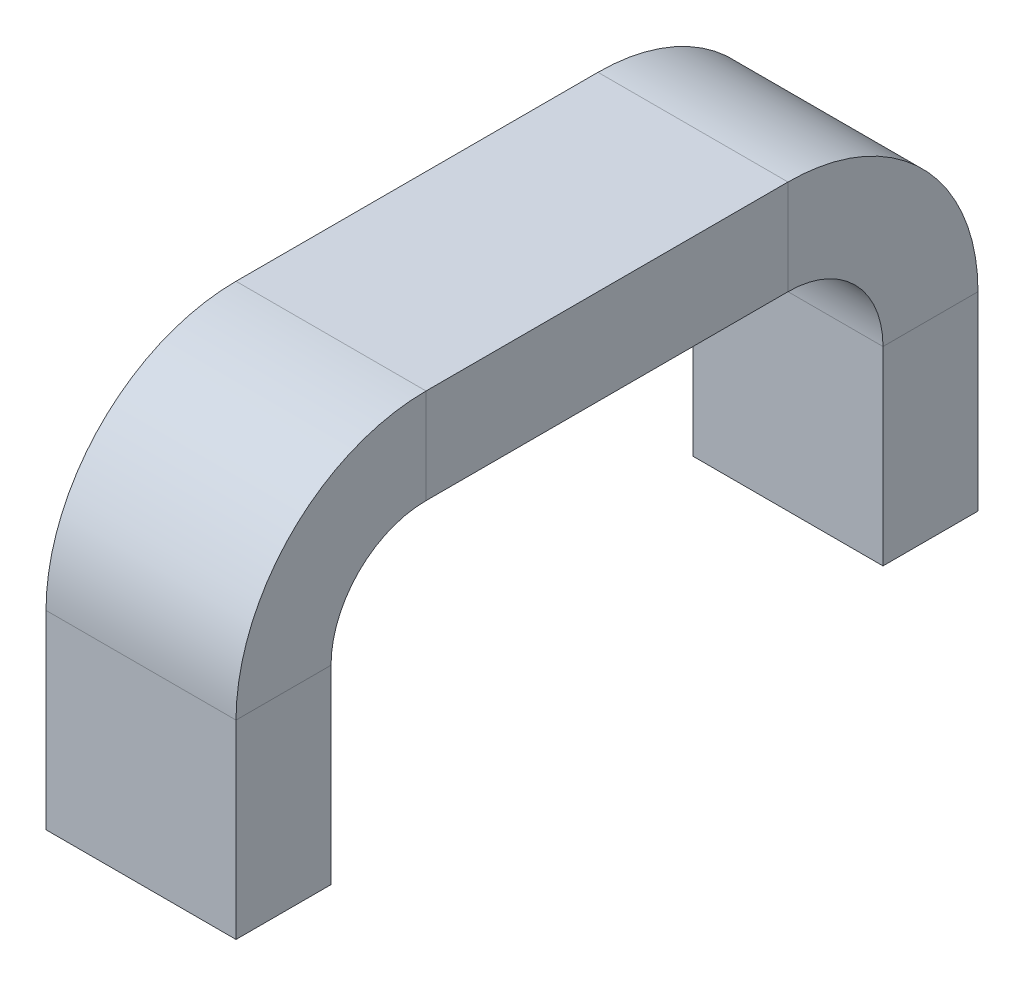
ISO-10303-21;
HEADER;
FILE_DESCRIPTION(('STEP AP214'),'2;1');
FILE_NAME('part.step','',(''),(''),'','','');
FILE_SCHEMA(('AUTOMOTIVE_DESIGN { 1 0 10303 214 1 1 1 1 }'));
ENDSEC;
DATA;
#1=APPLICATION_CONTEXT('core data for automotive mechanical design processes');
#2=APPLICATION_PROTOCOL_DEFINITION('international standard','automotive_design',2000,#1);
#3=PRODUCT_CONTEXT('',#1,'mechanical');
#4=PRODUCT('Part','Part','',(#3));
#5=PRODUCT_RELATED_PRODUCT_CATEGORY('part','',(#4));
#6=PRODUCT_DEFINITION_FORMATION('','',#4);
#7=PRODUCT_DEFINITION_CONTEXT('part definition',#1,'design');
#8=PRODUCT_DEFINITION('design','',#6,#7);
#9=PRODUCT_DEFINITION_SHAPE('','',#8);
#10=(LENGTH_UNIT() NAMED_UNIT(*) SI_UNIT(.MILLI.,.METRE.));
#11=(NAMED_UNIT(*) PLANE_ANGLE_UNIT() SI_UNIT($,.RADIAN.));
#12=(NAMED_UNIT(*) SI_UNIT($,.STERADIAN.) SOLID_ANGLE_UNIT());
#13=UNCERTAINTY_MEASURE_WITH_UNIT(LENGTH_MEASURE(1.E-05),#10,'distance_accuracy_value','');
#14=(GEOMETRIC_REPRESENTATION_CONTEXT(3) GLOBAL_UNCERTAINTY_ASSIGNED_CONTEXT((#13)) GLOBAL_UNIT_ASSIGNED_CONTEXT((#10,
#11,#12)) REPRESENTATION_CONTEXT('',''));
#15=CARTESIAN_POINT('',(0.,0.,0.));
#16=DIRECTION('',(0.,0.,1.));
#17=DIRECTION('',(1.,0.,0.));
#18=AXIS2_PLACEMENT_3D('',#15,#16,#17);
#19=CARTESIAN_POINT('',(20.,20.,0.));
#20=DIRECTION('',(1.,0.,0.));
#21=DIRECTION('',(0.,0.,-1.));
#22=AXIS2_PLACEMENT_3D('',#19,#20,#21);
#23=PLANE('',#22);
#24=DIRECTION('',(0.,0.,1.));
#25=VECTOR('',#24,1.);
#26=CARTESIAN_POINT('',(20.,20.,0.));
#27=LINE('',#26,#25);
#28=CARTESIAN_POINT('',(20.,20.,0.));
#29=VERTEX_POINT('',#28);
#30=CARTESIAN_POINT('',(20.,20.,10.));
#31=VERTEX_POINT('',#30);
#32=EDGE_CURVE('E11',#29,#31,#27,.T.);
#33=ORIENTED_EDGE('',*,*,#32,.F.);
#34=CARTESIAN_POINT('',(20.,20.,-10.));
#35=DIRECTION('',(1.,0.,0.));
#36=DIRECTION('',(0.,0.,-1.));
#37=AXIS2_PLACEMENT_3D('',#34,#35,#36);
#38=CIRCLE('',#37,10.);
#39=CARTESIAN_POINT('',(20.,30.,-9.99999999999999));
#40=VERTEX_POINT('',#39);
#41=EDGE_CURVE('E152',#29,#40,#38,.F.);
#42=ORIENTED_EDGE('',*,*,#41,.T.);
#43=DIRECTION('',(0.,-1.,0.));
#44=VECTOR('',#43,1.);
#45=CARTESIAN_POINT('',(20.,40.,-9.99999999999999));
#46=LINE('',#45,#44);
#47=CARTESIAN_POINT('',(20.,40.,-9.99999999999999));
#48=VERTEX_POINT('',#47);
#49=EDGE_CURVE('E47',#48,#40,#46,.T.);
#50=ORIENTED_EDGE('',*,*,#49,.F.);
#51=CARTESIAN_POINT('',(20.,20.,-10.));
#52=DIRECTION('',(1.,0.,0.));
#53=DIRECTION('',(0.,0.,-1.));
#54=AXIS2_PLACEMENT_3D('',#51,#52,#53);
#55=CIRCLE('',#54,20.);
#56=EDGE_CURVE('E247',#31,#48,#55,.F.);
#57=ORIENTED_EDGE('',*,*,#56,.F.);
#58=EDGE_LOOP('',(#33,#42,#50,#57));
#59=FACE_BOUND('',#58,.T.);
#60=ADVANCED_FACE('F39',(#59),#23,.T.);
#61=CARTESIAN_POINT('',(20.,40.,-9.99999999999999));
#62=DIRECTION('',(1.,0.,0.));
#63=DIRECTION('',(0.,0.,-1.));
#64=AXIS2_PLACEMENT_3D('',#61,#62,#63);
#65=PLANE('',#64);
#66=DIRECTION('',(0.,1.,0.));
#67=VECTOR('',#66,1.);
#68=CARTESIAN_POINT('',(20.,0.,0.));
#69=LINE('',#68,#67);
#70=CARTESIAN_POINT('',(20.,0.,0.));
#71=VERTEX_POINT('',#70);
#72=EDGE_CURVE('E157',#71,#29,#69,.T.);
#73=ORIENTED_EDGE('',*,*,#72,.T.);
#74=ORIENTED_EDGE('',*,*,#32,.T.);
#75=DIRECTION('',(0.,1.,0.));
#76=VECTOR('',#75,1.);
#77=CARTESIAN_POINT('',(20.,0.,10.));
#78=LINE('',#77,#76);
#79=CARTESIAN_POINT('',(20.,0.,10.));
#80=VERTEX_POINT('',#79);
#81=EDGE_CURVE('E260',#80,#31,#78,.T.);
#82=ORIENTED_EDGE('',*,*,#81,.F.);
#83=DIRECTION('',(0.,0.,1.));
#84=VECTOR('',#83,1.);
#85=CARTESIAN_POINT('',(20.,0.,0.));
#86=LINE('',#85,#84);
#87=EDGE_CURVE('E262',#71,#80,#86,.T.);
#88=ORIENTED_EDGE('',*,*,#87,.F.);
#89=EDGE_LOOP('',(#73,#74,#82,#88));
#90=FACE_BOUND('',#89,.T.);
#91=ADVANCED_FACE('F273',(#90),#65,.T.);
#92=CARTESIAN_POINT('',(0.,30.,-9.99999999999999));
#93=DIRECTION('',(-1.,0.,0.));
#94=DIRECTION('',(0.,0.,1.));
#95=AXIS2_PLACEMENT_3D('',#92,#93,#94);
#96=PLANE('',#95);
#97=DIRECTION('',(0.,1.,0.));
#98=VECTOR('',#97,1.);
#99=CARTESIAN_POINT('',(0.,30.,-9.99999999999999));
#100=LINE('',#99,#98);
#101=CARTESIAN_POINT('',(0.,30.,-9.99999999999999));
#102=VERTEX_POINT('',#101);
#103=CARTESIAN_POINT('',(0.,40.,-9.99999999999999));
#104=VERTEX_POINT('',#103);
#105=EDGE_CURVE('E150',#102,#104,#100,.T.);
#106=ORIENTED_EDGE('',*,*,#105,.F.);
#107=CARTESIAN_POINT('',(0.,20.,-10.));
#108=DIRECTION('',(1.,0.,0.));
#109=DIRECTION('',(0.,0.,-1.));
#110=AXIS2_PLACEMENT_3D('',#107,#108,#109);
#111=CIRCLE('',#110,10.);
#112=CARTESIAN_POINT('',(0.,20.,0.));
#113=VERTEX_POINT('',#112);
#114=EDGE_CURVE('E164',#113,#102,#111,.F.);
#115=ORIENTED_EDGE('',*,*,#114,.F.);
#116=DIRECTION('',(0.,0.,-1.));
#117=VECTOR('',#116,1.);
#118=CARTESIAN_POINT('',(0.,20.,10.));
#119=LINE('',#118,#117);
#120=CARTESIAN_POINT('',(0.,20.,10.));
#121=VERTEX_POINT('',#120);
#122=EDGE_CURVE('E238',#121,#113,#119,.T.);
#123=ORIENTED_EDGE('',*,*,#122,.F.);
#124=CARTESIAN_POINT('',(0.,20.,-10.));
#125=DIRECTION('',(1.,0.,0.));
#126=DIRECTION('',(0.,0.,-1.));
#127=AXIS2_PLACEMENT_3D('',#124,#125,#126);
#128=CIRCLE('',#127,20.);
#129=EDGE_CURVE('E192',#121,#104,#128,.F.);
#130=ORIENTED_EDGE('',*,*,#129,.T.);
#131=EDGE_LOOP('',(#106,#115,#123,#130));
#132=FACE_BOUND('',#131,.T.);
#133=ADVANCED_FACE('F252',(#132),#96,.T.);
#134=CARTESIAN_POINT('',(0.,20.,10.));
#135=DIRECTION('',(-1.,0.,0.));
#136=DIRECTION('',(0.,0.,1.));
#137=AXIS2_PLACEMENT_3D('',#134,#135,#136);
#138=PLANE('',#137);
#139=DIRECTION('',(0.,0.,-1.));
#140=VECTOR('',#139,1.);
#141=CARTESIAN_POINT('',(0.,30.,0.));
#142=LINE('',#141,#140);
#143=CARTESIAN_POINT('',(0.,30.,-48.1));
#144=VERTEX_POINT('',#143);
#145=EDGE_CURVE('E205',#102,#144,#142,.T.);
#146=ORIENTED_EDGE('',*,*,#145,.F.);
#147=ORIENTED_EDGE('',*,*,#105,.T.);
#148=DIRECTION('',(0.,0.,-1.));
#149=VECTOR('',#148,1.);
#150=CARTESIAN_POINT('',(0.,40.,0.));
#151=LINE('',#150,#149);
#152=CARTESIAN_POINT('',(0.,40.,-48.0999999999999));
#153=VERTEX_POINT('',#152);
#154=EDGE_CURVE('E190',#104,#153,#151,.T.);
#155=ORIENTED_EDGE('',*,*,#154,.T.);
#156=DIRECTION('',(0.,-1.,0.));
#157=VECTOR('',#156,1.);
#158=CARTESIAN_POINT('',(0.,40.,-48.0999999999999));
#159=LINE('',#158,#157);
#160=EDGE_CURVE('E97',#153,#144,#159,.T.);
#161=ORIENTED_EDGE('',*,*,#160,.T.);
#162=EDGE_LOOP('',(#146,#147,#155,#161));
#163=FACE_BOUND('',#162,.T.);
#164=ADVANCED_FACE('F240',(#163),#138,.T.);
#165=CARTESIAN_POINT('',(20.,30.,-48.1));
#166=DIRECTION('',(1.,0.,0.));
#167=DIRECTION('',(0.,0.,-1.));
#168=AXIS2_PLACEMENT_3D('',#165,#166,#167);
#169=PLANE('',#168);
#170=DIRECTION('',(0.,1.,0.));
#171=VECTOR('',#170,1.);
#172=CARTESIAN_POINT('',(20.,30.,-48.1));
#173=LINE('',#172,#171);
#174=CARTESIAN_POINT('',(20.,30.,-48.1));
#175=VERTEX_POINT('',#174);
#176=CARTESIAN_POINT('',(20.,40.,-48.0999999999999));
#177=VERTEX_POINT('',#176);
#178=EDGE_CURVE('E236',#175,#177,#173,.T.);
#179=ORIENTED_EDGE('',*,*,#178,.F.);
#180=CARTESIAN_POINT('',(20.,20.,-48.1));
#181=DIRECTION('',(1.,0.,0.));
#182=DIRECTION('',(0.,0.,-1.));
#183=AXIS2_PLACEMENT_3D('',#180,#181,#182);
#184=CIRCLE('',#183,10.);
#185=CARTESIAN_POINT('',(20.,20.,-58.1));
#186=VERTEX_POINT('',#185);
#187=EDGE_CURVE('E172',#175,#186,#184,.F.);
#188=ORIENTED_EDGE('',*,*,#187,.T.);
#189=DIRECTION('',(0.,0.,1.));
#190=VECTOR('',#189,1.);
#191=CARTESIAN_POINT('',(20.,20.,-68.1));
#192=LINE('',#191,#190);
#193=CARTESIAN_POINT('',(20.,20.,-68.1));
#194=VERTEX_POINT('',#193);
#195=EDGE_CURVE('E55',#194,#186,#192,.T.);
#196=ORIENTED_EDGE('',*,*,#195,.F.);
#197=CARTESIAN_POINT('',(20.,20.,-48.1));
#198=DIRECTION('',(1.,0.,0.));
#199=DIRECTION('',(0.,0.,-1.));
#200=AXIS2_PLACEMENT_3D('',#197,#198,#199);
#201=CIRCLE('',#200,20.);
#202=EDGE_CURVE('E264',#177,#194,#201,.F.);
#203=ORIENTED_EDGE('',*,*,#202,.F.);
#204=EDGE_LOOP('',(#179,#188,#196,#203));
#205=FACE_BOUND('',#204,.T.);
#206=ADVANCED_FACE('F301',(#205),#169,.T.);
#207=CARTESIAN_POINT('',(20.,20.,-68.1));
#208=DIRECTION('',(1.,0.,0.));
#209=DIRECTION('',(0.,0.,-1.));
#210=AXIS2_PLACEMENT_3D('',#207,#208,#209);
#211=PLANE('',#210);
#212=DIRECTION('',(0.,0.,-1.));
#213=VECTOR('',#212,1.);
#214=CARTESIAN_POINT('',(20.,30.,0.));
#215=LINE('',#214,#213);
#216=EDGE_CURVE('E142',#40,#175,#215,.T.);
#217=ORIENTED_EDGE('',*,*,#216,.T.);
#218=ORIENTED_EDGE('',*,*,#178,.T.);
#219=DIRECTION('',(0.,0.,-1.));
#220=VECTOR('',#219,1.);
#221=CARTESIAN_POINT('',(20.,40.,0.));
#222=LINE('',#221,#220);
#223=EDGE_CURVE('E145',#48,#177,#222,.T.);
#224=ORIENTED_EDGE('',*,*,#223,.F.);
#225=ORIENTED_EDGE('',*,*,#49,.T.);
#226=EDGE_LOOP('',(#217,#218,#224,#225));
#227=FACE_BOUND('',#226,.T.);
#228=ADVANCED_FACE('F140',(#227),#211,.T.);
#229=CARTESIAN_POINT('',(0.,20.,-58.1));
#230=DIRECTION('',(-1.,0.,0.));
#231=DIRECTION('',(0.,0.,1.));
#232=AXIS2_PLACEMENT_3D('',#229,#230,#231);
#233=PLANE('',#232);
#234=DIRECTION('',(0.,0.,-1.));
#235=VECTOR('',#234,1.);
#236=CARTESIAN_POINT('',(0.,20.,-58.1));
#237=LINE('',#236,#235);
#238=CARTESIAN_POINT('',(0.,20.,-58.1));
#239=VERTEX_POINT('',#238);
#240=CARTESIAN_POINT('',(0.,20.,-68.1));
#241=VERTEX_POINT('',#240);
#242=EDGE_CURVE('E104',#239,#241,#237,.T.);
#243=ORIENTED_EDGE('',*,*,#242,.F.);
#244=CARTESIAN_POINT('',(0.,20.,-48.1));
#245=DIRECTION('',(1.,0.,0.));
#246=DIRECTION('',(0.,0.,-1.));
#247=AXIS2_PLACEMENT_3D('',#244,#245,#246);
#248=CIRCLE('',#247,10.);
#249=EDGE_CURVE('E207',#144,#239,#248,.F.);
#250=ORIENTED_EDGE('',*,*,#249,.F.);
#251=ORIENTED_EDGE('',*,*,#160,.F.);
#252=CARTESIAN_POINT('',(0.,20.,-48.1));
#253=DIRECTION('',(1.,0.,0.));
#254=DIRECTION('',(0.,0.,-1.));
#255=AXIS2_PLACEMENT_3D('',#252,#253,#254);
#256=CIRCLE('',#255,20.);
#257=EDGE_CURVE('E188',#153,#241,#256,.F.);
#258=ORIENTED_EDGE('',*,*,#257,.T.);
#259=EDGE_LOOP('',(#243,#250,#251,#258));
#260=FACE_BOUND('',#259,.T.);
#261=ADVANCED_FACE('F307',(#260),#233,.T.);
#262=CARTESIAN_POINT('',(0.,40.,-48.0999999999999));
#263=DIRECTION('',(-1.,0.,0.));
#264=DIRECTION('',(0.,0.,1.));
#265=AXIS2_PLACEMENT_3D('',#262,#263,#264);
#266=PLANE('',#265);
#267=DIRECTION('',(0.,-1.,0.));
#268=VECTOR('',#267,1.);
#269=CARTESIAN_POINT('',(0.,30.,-58.1));
#270=LINE('',#269,#268);
#271=CARTESIAN_POINT('',(0.,0.,-58.1));
#272=VERTEX_POINT('',#271);
#273=EDGE_CURVE('E178',#239,#272,#270,.T.);
#274=ORIENTED_EDGE('',*,*,#273,.F.);
#275=ORIENTED_EDGE('',*,*,#242,.T.);
#276=DIRECTION('',(0.,-1.,0.));
#277=VECTOR('',#276,1.);
#278=CARTESIAN_POINT('',(0.,30.,-68.1));
#279=LINE('',#278,#277);
#280=CARTESIAN_POINT('',(0.,0.,-68.1));
#281=VERTEX_POINT('',#280);
#282=EDGE_CURVE('E185',#241,#281,#279,.T.);
#283=ORIENTED_EDGE('',*,*,#282,.T.);
#284=DIRECTION('',(0.,0.,1.));
#285=VECTOR('',#284,1.);
#286=CARTESIAN_POINT('',(0.,0.,-68.1));
#287=LINE('',#286,#285);
#288=EDGE_CURVE('E181',#281,#272,#287,.T.);
#289=ORIENTED_EDGE('',*,*,#288,.T.);
#290=EDGE_LOOP('',(#274,#275,#283,#289));
#291=FACE_BOUND('',#290,.T.);
#292=ADVANCED_FACE('F310',(#291),#266,.T.);
#293=CARTESIAN_POINT('',(20.,30.,-58.1));
#294=DIRECTION('',(0.,0.,-1.));
#295=DIRECTION('',(0.,1.,0.));
#296=AXIS2_PLACEMENT_3D('',#293,#294,#295);
#297=PLANE('',#296);
#298=ORIENTED_EDGE('',*,*,#273,.T.);
#299=DIRECTION('',(-1.,0.,0.));
#300=VECTOR('',#299,1.);
#301=CARTESIAN_POINT('',(20.,0.,-58.1));
#302=LINE('',#301,#300);
#303=CARTESIAN_POINT('',(20.,0.,-58.1));
#304=VERTEX_POINT('',#303);
#305=EDGE_CURVE('E231',#304,#272,#302,.T.);
#306=ORIENTED_EDGE('',*,*,#305,.F.);
#307=DIRECTION('',(0.,-1.,0.));
#308=VECTOR('',#307,1.);
#309=CARTESIAN_POINT('',(20.,30.,-58.1));
#310=LINE('',#309,#308);
#311=EDGE_CURVE('E110',#186,#304,#310,.T.);
#312=ORIENTED_EDGE('',*,*,#311,.F.);
#313=DIRECTION('',(-1.,0.,0.));
#314=VECTOR('',#313,1.);
#315=CARTESIAN_POINT('',(20.,20.,-58.1));
#316=LINE('',#315,#314);
#317=EDGE_CURVE('E174',#186,#239,#316,.T.);
#318=ORIENTED_EDGE('',*,*,#317,.T.);
#319=EDGE_LOOP('',(#298,#306,#312,#318));
#320=FACE_BOUND('',#319,.T.);
#321=ADVANCED_FACE('F313',(#320),#297,.F.);
#322=CARTESIAN_POINT('',(20.,0.,-68.1));
#323=DIRECTION('',(0.,-1.,0.));
#324=DIRECTION('',(0.,0.,-1.));
#325=AXIS2_PLACEMENT_3D('',#322,#323,#324);
#326=PLANE('',#325);
#327=CARTESIAN_POINT('',(10.,0.,-63.1));
#328=DIRECTION('',(0.,-1.,0.));
#329=DIRECTION('',(0.,0.,-1.));
#330=AXIS2_PLACEMENT_3D('',#327,#328,#329);
#331=CIRCLE('',#330,2.6);
#332=CARTESIAN_POINT('',(10.,0.,-65.7));
#333=VERTEX_POINT('',#332);
#334=EDGE_CURVE('E461',#333,#333,#331,.T.);
#335=ORIENTED_EDGE('',*,*,#334,.F.);
#336=EDGE_LOOP('',(#335));
#337=FACE_BOUND('',#336,.T.);
#338=ORIENTED_EDGE('',*,*,#288,.F.);
#339=DIRECTION('',(-1.,0.,0.));
#340=VECTOR('',#339,1.);
#341=CARTESIAN_POINT('',(20.,0.,-68.1));
#342=LINE('',#341,#340);
#343=CARTESIAN_POINT('',(20.,0.,-68.1));
#344=VERTEX_POINT('',#343);
#345=EDGE_CURVE('E229',#344,#281,#342,.T.);
#346=ORIENTED_EDGE('',*,*,#345,.F.);
#347=DIRECTION('',(0.,0.,1.));
#348=VECTOR('',#347,1.);
#349=CARTESIAN_POINT('',(20.,0.,-68.1));
#350=LINE('',#349,#348);
#351=EDGE_CURVE('E471',#344,#304,#350,.T.);
#352=ORIENTED_EDGE('',*,*,#351,.T.);
#353=ORIENTED_EDGE('',*,*,#305,.T.);
#354=EDGE_LOOP('',(#338,#346,#352,#353));
#355=FACE_BOUND('',#354,.T.);
#356=ADVANCED_FACE('F317',(#337,#355),#326,.T.);
#357=CARTESIAN_POINT('',(20.,30.,-68.1));
#358=DIRECTION('',(0.,0.,-1.));
#359=DIRECTION('',(0.,1.,0.));
#360=AXIS2_PLACEMENT_3D('',#357,#358,#359);
#361=PLANE('',#360);
#362=ORIENTED_EDGE('',*,*,#282,.F.);
#363=DIRECTION('',(-1.,0.,0.));
#364=VECTOR('',#363,1.);
#365=CARTESIAN_POINT('',(20.,20.,-68.1));
#366=LINE('',#365,#364);
#367=EDGE_CURVE('E226',#194,#241,#366,.T.);
#368=ORIENTED_EDGE('',*,*,#367,.F.);
#369=DIRECTION('',(0.,-1.,0.));
#370=VECTOR('',#369,1.);
#371=CARTESIAN_POINT('',(20.,30.,-68.1));
#372=LINE('',#371,#370);
#373=EDGE_CURVE('E474',#194,#344,#372,.T.);
#374=ORIENTED_EDGE('',*,*,#373,.T.);
#375=ORIENTED_EDGE('',*,*,#345,.T.);
#376=EDGE_LOOP('',(#362,#368,#374,#375));
#377=FACE_BOUND('',#376,.T.);
#378=ADVANCED_FACE('F321',(#377),#361,.T.);
#379=CARTESIAN_POINT('',(20.,20.,-48.1));
#380=DIRECTION('',(-1.,0.,0.));
#381=DIRECTION('',(0.,0.,1.));
#382=AXIS2_PLACEMENT_3D('',#379,#380,#381);
#383=CYLINDRICAL_SURFACE('',#382,20.);
#384=ORIENTED_EDGE('',*,*,#257,.F.);
#385=DIRECTION('',(-1.,0.,0.));
#386=VECTOR('',#385,1.);
#387=CARTESIAN_POINT('',(20.,40.,-48.0999999999999));
#388=LINE('',#387,#386);
#389=EDGE_CURVE('E223',#177,#153,#388,.T.);
#390=ORIENTED_EDGE('',*,*,#389,.F.);
#391=ORIENTED_EDGE('',*,*,#202,.T.);
#392=ORIENTED_EDGE('',*,*,#367,.T.);
#393=EDGE_LOOP('',(#384,#390,#391,#392));
#394=FACE_BOUND('',#393,.T.);
#395=ADVANCED_FACE('F325',(#394),#383,.T.);
#396=CARTESIAN_POINT('',(20.,40.,0.));
#397=DIRECTION('',(0.,1.,0.));
#398=DIRECTION('',(0.,0.,1.));
#399=AXIS2_PLACEMENT_3D('',#396,#397,#398);
#400=PLANE('',#399);
#401=ORIENTED_EDGE('',*,*,#154,.F.);
#402=DIRECTION('',(-1.,0.,0.));
#403=VECTOR('',#402,1.);
#404=CARTESIAN_POINT('',(20.,40.,-9.99999999999999));
#405=LINE('',#404,#403);
#406=EDGE_CURVE('E220',#48,#104,#405,.T.);
#407=ORIENTED_EDGE('',*,*,#406,.F.);
#408=ORIENTED_EDGE('',*,*,#223,.T.);
#409=ORIENTED_EDGE('',*,*,#389,.T.);
#410=EDGE_LOOP('',(#401,#407,#408,#409));
#411=FACE_BOUND('',#410,.T.);
#412=ADVANCED_FACE('F249',(#411),#400,.T.);
#413=CARTESIAN_POINT('',(20.,20.,-10.));
#414=DIRECTION('',(-1.,0.,0.));
#415=DIRECTION('',(0.,0.,1.));
#416=AXIS2_PLACEMENT_3D('',#413,#414,#415);
#417=CYLINDRICAL_SURFACE('',#416,20.);
#418=ORIENTED_EDGE('',*,*,#129,.F.);
#419=DIRECTION('',(-1.,0.,0.));
#420=VECTOR('',#419,1.);
#421=CARTESIAN_POINT('',(20.,20.,10.));
#422=LINE('',#421,#420);
#423=EDGE_CURVE('E217',#31,#121,#422,.T.);
#424=ORIENTED_EDGE('',*,*,#423,.F.);
#425=ORIENTED_EDGE('',*,*,#56,.T.);
#426=ORIENTED_EDGE('',*,*,#406,.T.);
#427=EDGE_LOOP('',(#418,#424,#425,#426));
#428=FACE_BOUND('',#427,.T.);
#429=ADVANCED_FACE('F245',(#428),#417,.T.);
#430=CARTESIAN_POINT('',(20.,0.,10.));
#431=DIRECTION('',(0.,0.,1.));
#432=DIRECTION('',(1.,0.,0.));
#433=AXIS2_PLACEMENT_3D('',#430,#431,#432);
#434=PLANE('',#433);
#435=DIRECTION('',(0.,1.,0.));
#436=VECTOR('',#435,1.);
#437=CARTESIAN_POINT('',(0.,0.,10.));
#438=LINE('',#437,#436);
#439=CARTESIAN_POINT('',(0.,0.,10.));
#440=VERTEX_POINT('',#439);
#441=EDGE_CURVE('E195',#440,#121,#438,.T.);
#442=ORIENTED_EDGE('',*,*,#441,.F.);
#443=DIRECTION('',(-1.,0.,0.));
#444=VECTOR('',#443,1.);
#445=CARTESIAN_POINT('',(20.,0.,10.));
#446=LINE('',#445,#444);
#447=EDGE_CURVE('E215',#80,#440,#446,.T.);
#448=ORIENTED_EDGE('',*,*,#447,.F.);
#449=ORIENTED_EDGE('',*,*,#81,.T.);
#450=ORIENTED_EDGE('',*,*,#423,.T.);
#451=EDGE_LOOP('',(#442,#448,#449,#450));
#452=FACE_BOUND('',#451,.T.);
#453=ADVANCED_FACE('F258',(#452),#434,.T.);
#454=CARTESIAN_POINT('',(20.,0.,0.));
#455=DIRECTION('',(0.,-1.,0.));
#456=DIRECTION('',(0.,0.,-1.));
#457=AXIS2_PLACEMENT_3D('',#454,#455,#456);
#458=PLANE('',#457);
#459=CARTESIAN_POINT('',(10.,0.,5.));
#460=DIRECTION('',(0.,-1.,0.));
#461=DIRECTION('',(0.,0.,-1.));
#462=AXIS2_PLACEMENT_3D('',#459,#460,#461);
#463=CIRCLE('',#462,2.6);
#464=CARTESIAN_POINT('',(10.,0.,2.4));
#465=VERTEX_POINT('',#464);
#466=EDGE_CURVE('E463',#465,#465,#463,.T.);
#467=ORIENTED_EDGE('',*,*,#466,.F.);
#468=EDGE_LOOP('',(#467));
#469=FACE_BOUND('',#468,.T.);
#470=DIRECTION('',(0.,0.,1.));
#471=VECTOR('',#470,1.);
#472=CARTESIAN_POINT('',(0.,0.,0.));
#473=LINE('',#472,#471);
#474=CARTESIAN_POINT('',(0.,0.,0.));
#475=VERTEX_POINT('',#474);
#476=EDGE_CURVE('E198',#475,#440,#473,.T.);
#477=ORIENTED_EDGE('',*,*,#476,.F.);
#478=DIRECTION('',(-1.,0.,0.));
#479=VECTOR('',#478,1.);
#480=CARTESIAN_POINT('',(20.,0.,0.));
#481=LINE('',#480,#479);
#482=EDGE_CURVE('E213',#71,#475,#481,.T.);
#483=ORIENTED_EDGE('',*,*,#482,.F.);
#484=ORIENTED_EDGE('',*,*,#87,.T.);
#485=ORIENTED_EDGE('',*,*,#447,.T.);
#486=EDGE_LOOP('',(#477,#483,#484,#485));
#487=FACE_BOUND('',#486,.T.);
#488=ADVANCED_FACE('F279',(#469,#487),#458,.T.);
#489=CARTESIAN_POINT('',(20.,0.,0.));
#490=DIRECTION('',(0.,0.,1.));
#491=DIRECTION('',(1.,0.,0.));
#492=AXIS2_PLACEMENT_3D('',#489,#490,#491);
#493=PLANE('',#492);
#494=DIRECTION('',(0.,1.,0.));
#495=VECTOR('',#494,1.);
#496=CARTESIAN_POINT('',(0.,0.,0.));
#497=LINE('',#496,#495);
#498=EDGE_CURVE('E201',#475,#113,#497,.T.);
#499=ORIENTED_EDGE('',*,*,#498,.T.);
#500=DIRECTION('',(-1.,0.,0.));
#501=VECTOR('',#500,1.);
#502=CARTESIAN_POINT('',(20.,20.,0.));
#503=LINE('',#502,#501);
#504=EDGE_CURVE('E166',#29,#113,#503,.T.);
#505=ORIENTED_EDGE('',*,*,#504,.F.);
#506=ORIENTED_EDGE('',*,*,#72,.F.);
#507=ORIENTED_EDGE('',*,*,#482,.T.);
#508=EDGE_LOOP('',(#499,#505,#506,#507));
#509=FACE_BOUND('',#508,.T.);
#510=ADVANCED_FACE('F275',(#509),#493,.F.);
#511=CARTESIAN_POINT('',(20.,20.,-10.));
#512=DIRECTION('',(-1.,0.,0.));
#513=DIRECTION('',(0.,0.,1.));
#514=AXIS2_PLACEMENT_3D('',#511,#512,#513);
#515=CYLINDRICAL_SURFACE('',#514,10.);
#516=ORIENTED_EDGE('',*,*,#114,.T.);
#517=DIRECTION('',(-1.,0.,0.));
#518=VECTOR('',#517,1.);
#519=CARTESIAN_POINT('',(20.,30.,-9.99999999999999));
#520=LINE('',#519,#518);
#521=EDGE_CURVE('E161',#40,#102,#520,.T.);
#522=ORIENTED_EDGE('',*,*,#521,.F.);
#523=ORIENTED_EDGE('',*,*,#41,.F.);
#524=ORIENTED_EDGE('',*,*,#504,.T.);
#525=EDGE_LOOP('',(#516,#522,#523,#524));
#526=FACE_BOUND('',#525,.T.);
#527=ADVANCED_FACE('F162',(#526),#515,.F.);
#528=CARTESIAN_POINT('',(20.,30.,0.));
#529=DIRECTION('',(0.,1.,0.));
#530=DIRECTION('',(0.,0.,1.));
#531=AXIS2_PLACEMENT_3D('',#528,#529,#530);
#532=PLANE('',#531);
#533=ORIENTED_EDGE('',*,*,#145,.T.);
#534=DIRECTION('',(-1.,0.,0.));
#535=VECTOR('',#534,1.);
#536=CARTESIAN_POINT('',(20.,30.,-48.1));
#537=LINE('',#536,#535);
#538=EDGE_CURVE('E167',#175,#144,#537,.T.);
#539=ORIENTED_EDGE('',*,*,#538,.F.);
#540=ORIENTED_EDGE('',*,*,#216,.F.);
#541=ORIENTED_EDGE('',*,*,#521,.T.);
#542=EDGE_LOOP('',(#533,#539,#540,#541));
#543=FACE_BOUND('',#542,.T.);
#544=ADVANCED_FACE('F169',(#543),#532,.F.);
#545=CARTESIAN_POINT('',(20.,20.,-48.1));
#546=DIRECTION('',(-1.,0.,0.));
#547=DIRECTION('',(0.,0.,1.));
#548=AXIS2_PLACEMENT_3D('',#545,#546,#547);
#549=CYLINDRICAL_SURFACE('',#548,10.);
#550=ORIENTED_EDGE('',*,*,#249,.T.);
#551=ORIENTED_EDGE('',*,*,#317,.F.);
#552=ORIENTED_EDGE('',*,*,#187,.F.);
#553=ORIENTED_EDGE('',*,*,#538,.T.);
#554=EDGE_LOOP('',(#550,#551,#552,#553));
#555=FACE_BOUND('',#554,.T.);
#556=ADVANCED_FACE('F368',(#555),#549,.F.);
#557=CARTESIAN_POINT('',(20.,20.,-48.1));
#558=DIRECTION('',(1.,0.,0.));
#559=DIRECTION('',(0.,0.,-1.));
#560=AXIS2_PLACEMENT_3D('',#557,#558,#559);
#561=PLANE('',#560);
#562=ORIENTED_EDGE('',*,*,#311,.T.);
#563=ORIENTED_EDGE('',*,*,#351,.F.);
#564=ORIENTED_EDGE('',*,*,#373,.F.);
#565=ORIENTED_EDGE('',*,*,#195,.T.);
#566=EDGE_LOOP('',(#562,#563,#564,#565));
#567=FACE_BOUND('',#566,.T.);
#568=ADVANCED_FACE('F378',(#567),#561,.T.);
#569=CARTESIAN_POINT('',(0.,20.,-48.1));
#570=DIRECTION('',(1.,0.,0.));
#571=DIRECTION('',(0.,0.,-1.));
#572=AXIS2_PLACEMENT_3D('',#569,#570,#571);
#573=PLANE('',#572);
#574=ORIENTED_EDGE('',*,*,#441,.T.);
#575=ORIENTED_EDGE('',*,*,#122,.T.);
#576=ORIENTED_EDGE('',*,*,#498,.F.);
#577=ORIENTED_EDGE('',*,*,#476,.T.);
#578=EDGE_LOOP('',(#574,#575,#576,#577));
#579=FACE_BOUND('',#578,.T.);
#580=ADVANCED_FACE('F277',(#579),#573,.F.);
#581=CARTESIAN_POINT('',(10.,10.,5.));
#582=DIRECTION('',(0.,-1.,0.));
#583=DIRECTION('',(0.,0.,-1.));
#584=AXIS2_PLACEMENT_3D('',#581,#582,#583);
#585=CONICAL_SURFACE('',#584,2.6,1.02974425867665);
#586=CARTESIAN_POINT('',(10.,11.5622376094717,5.));
#587=VERTEX_POINT('',#586);
#588=VERTEX_LOOP('',#587);
#589=FACE_BOUND('',#588,.T.);
#590=CARTESIAN_POINT('',(10.,10.,5.));
#591=DIRECTION('',(0.,-1.,0.));
#592=DIRECTION('',(0.,0.,-1.));
#593=AXIS2_PLACEMENT_3D('',#590,#591,#592);
#594=CIRCLE('',#593,2.6);
#595=CARTESIAN_POINT('',(10.,10.,2.4));
#596=VERTEX_POINT('',#595);
#597=EDGE_CURVE('E182',#596,#596,#594,.T.);
#598=ORIENTED_EDGE('',*,*,#597,.T.);
#599=EDGE_LOOP('',(#598));
#600=FACE_BOUND('',#599,.T.);
#601=ADVANCED_FACE('F398',(#589,#600),#585,.F.);
#602=CARTESIAN_POINT('',(10.,0.,5.));
#603=DIRECTION('',(0.,-1.,0.));
#604=DIRECTION('',(0.,0.,-1.));
#605=AXIS2_PLACEMENT_3D('',#602,#603,#604);
#606=CYLINDRICAL_SURFACE('',#605,2.6);
#607=ORIENTED_EDGE('',*,*,#597,.F.);
#608=EDGE_LOOP('',(#607));
#609=FACE_BOUND('',#608,.T.);
#610=ORIENTED_EDGE('',*,*,#466,.T.);
#611=EDGE_LOOP('',(#610));
#612=FACE_BOUND('',#611,.T.);
#613=ADVANCED_FACE('F421',(#609,#612),#606,.F.);
#614=CARTESIAN_POINT('',(10.,10.,-63.1));
#615=DIRECTION('',(0.,-1.,0.));
#616=DIRECTION('',(0.,0.,-1.));
#617=AXIS2_PLACEMENT_3D('',#614,#615,#616);
#618=CONICAL_SURFACE('',#617,2.6,1.02974425867665);
#619=CARTESIAN_POINT('',(10.,11.5622376094717,-63.1));
#620=VERTEX_POINT('',#619);
#621=VERTEX_LOOP('',#620);
#622=FACE_BOUND('',#621,.T.);
#623=CARTESIAN_POINT('',(10.,10.,-63.1));
#624=DIRECTION('',(0.,-1.,0.));
#625=DIRECTION('',(0.,0.,-1.));
#626=AXIS2_PLACEMENT_3D('',#623,#624,#625);
#627=CIRCLE('',#626,2.6);
#628=CARTESIAN_POINT('',(10.,10.,-65.7));
#629=VERTEX_POINT('',#628);
#630=EDGE_CURVE('E458',#629,#629,#627,.T.);
#631=ORIENTED_EDGE('',*,*,#630,.T.);
#632=EDGE_LOOP('',(#631));
#633=FACE_BOUND('',#632,.T.);
#634=ADVANCED_FACE('F431',(#622,#633),#618,.F.);
#635=CARTESIAN_POINT('',(10.,0.,-63.1));
#636=DIRECTION('',(0.,-1.,0.));
#637=DIRECTION('',(0.,0.,-1.));
#638=AXIS2_PLACEMENT_3D('',#635,#636,#637);
#639=CYLINDRICAL_SURFACE('',#638,2.6);
#640=ORIENTED_EDGE('',*,*,#630,.F.);
#641=EDGE_LOOP('',(#640));
#642=FACE_BOUND('',#641,.T.);
#643=ORIENTED_EDGE('',*,*,#334,.T.);
#644=EDGE_LOOP('',(#643));
#645=FACE_BOUND('',#644,.T.);
#646=ADVANCED_FACE('F441',(#642,#645),#639,.F.);
#647=CLOSED_SHELL('',(#60,#91,#133,#164,#206,#228,#261,#292,#321,#356,#378,#395,#412,#429,#453,
#488,#510,#527,#544,#556,#568,#580,#601,#613,#634,#646));
#648=MANIFOLD_SOLID_BREP('B2',#647);
#649=ADVANCED_BREP_SHAPE_REPRESENTATION('',(#18,#648),#14);
#650=SHAPE_DEFINITION_REPRESENTATION(#9,#649);
ENDSEC;
END-ISO-10303-21;
